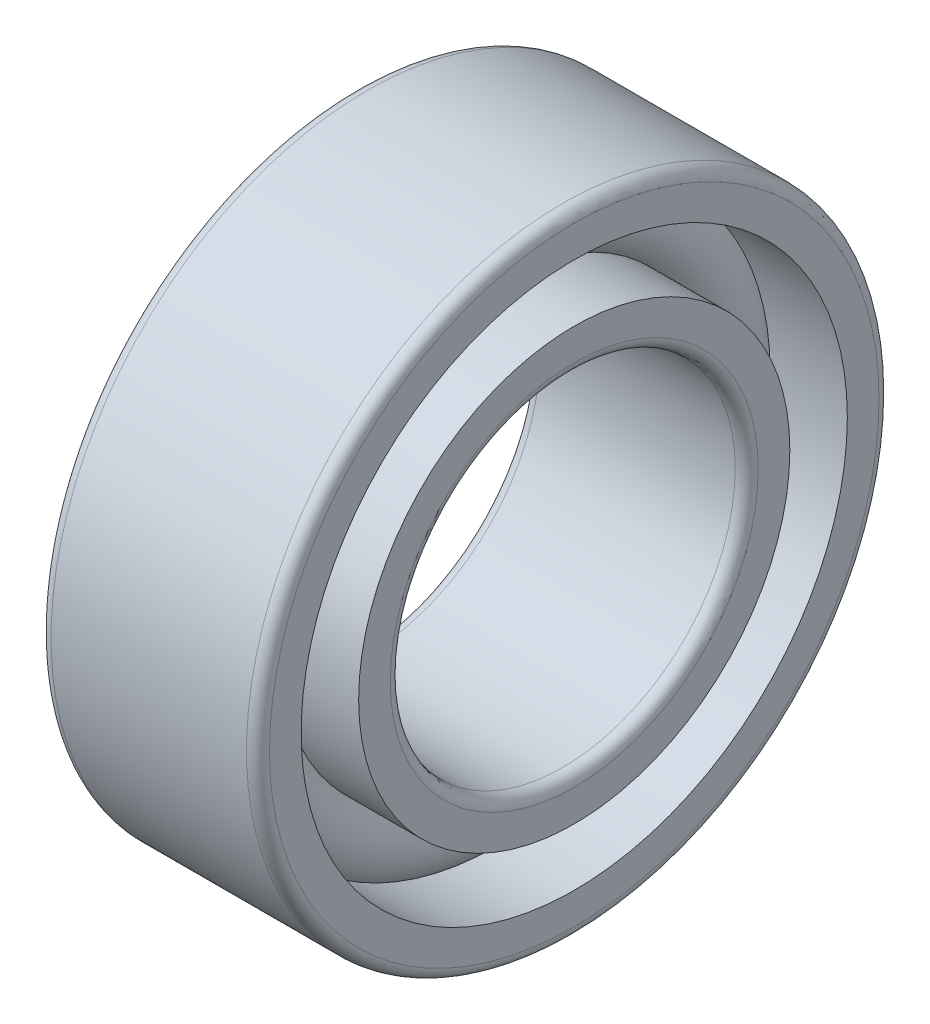
ISO-10303-21;
HEADER;
FILE_DESCRIPTION(('STEP AP214'),'2;1');
FILE_NAME('part.step','',(''),(''),'','','');
FILE_SCHEMA(('AUTOMOTIVE_DESIGN { 1 0 10303 214 1 1 1 1 }'));
ENDSEC;
DATA;
#1=APPLICATION_CONTEXT('core data for automotive mechanical design processes');
#2=APPLICATION_PROTOCOL_DEFINITION('international standard','automotive_design',2000,#1);
#3=PRODUCT_CONTEXT('',#1,'mechanical');
#4=PRODUCT('Part','Part','',(#3));
#5=PRODUCT_RELATED_PRODUCT_CATEGORY('part','',(#4));
#6=PRODUCT_DEFINITION_FORMATION('','',#4);
#7=PRODUCT_DEFINITION_CONTEXT('part definition',#1,'design');
#8=PRODUCT_DEFINITION('design','',#6,#7);
#9=PRODUCT_DEFINITION_SHAPE('','',#8);
#10=(LENGTH_UNIT() NAMED_UNIT(*) SI_UNIT(.MILLI.,.METRE.));
#11=(NAMED_UNIT(*) PLANE_ANGLE_UNIT() SI_UNIT($,.RADIAN.));
#12=(NAMED_UNIT(*) SI_UNIT($,.STERADIAN.) SOLID_ANGLE_UNIT());
#13=UNCERTAINTY_MEASURE_WITH_UNIT(LENGTH_MEASURE(1.E-05),#10,'distance_accuracy_value','');
#14=(GEOMETRIC_REPRESENTATION_CONTEXT(3) GLOBAL_UNCERTAINTY_ASSIGNED_CONTEXT((#13)) GLOBAL_UNIT_ASSIGNED_CONTEXT((#10,
#11,#12)) REPRESENTATION_CONTEXT('',''));
#15=CARTESIAN_POINT('',(0.,0.,0.));
#16=DIRECTION('',(0.,0.,1.));
#17=DIRECTION('',(1.,0.,0.));
#18=AXIS2_PLACEMENT_3D('',#15,#16,#17);
#19=CARTESIAN_POINT('',(0.,0.,0.));
#20=DIRECTION('',(-1.,0.,0.));
#21=DIRECTION('',(0.,0.,1.));
#22=AXIS2_PLACEMENT_3D('',#19,#20,#21);
#23=TOROIDAL_SURFACE('',#22,21.25,3.75);
#24=CARTESIAN_POINT('',(2.79508497187473,0.,0.));
#25=DIRECTION('',(-1.,0.,0.));
#26=DIRECTION('',(0.,0.,1.));
#27=AXIS2_PLACEMENT_3D('',#24,#25,#26);
#28=CIRCLE('',#27,23.75);
#29=CARTESIAN_POINT('',(2.79508497187473,0.,23.75));
#30=VERTEX_POINT('',#29);
#31=EDGE_CURVE('E39',#30,#30,#28,.F.);
#32=ORIENTED_EDGE('',*,*,#31,.T.);
#33=EDGE_LOOP('',(#32));
#34=FACE_BOUND('',#33,.T.);
#35=CARTESIAN_POINT('',(2.79508497187474,0.,0.));
#36=DIRECTION('',(-1.,0.,0.));
#37=DIRECTION('',(0.,0.,1.));
#38=AXIS2_PLACEMENT_3D('',#35,#36,#37);
#39=CIRCLE('',#38,18.75);
#40=CARTESIAN_POINT('',(2.79508497187474,0.,18.75));
#41=VERTEX_POINT('',#40);
#42=EDGE_CURVE('E10',#41,#41,#39,.T.);
#43=ORIENTED_EDGE('',*,*,#42,.T.);
#44=EDGE_LOOP('',(#43));
#45=FACE_BOUND('',#44,.T.);
#46=ADVANCED_FACE('F35',(#34,#45),#23,.T.);
#47=CARTESIAN_POINT('',(-20.6375,0.,0.));
#48=DIRECTION('',(1.,0.,0.));
#49=DIRECTION('',(0.,0.,-1.));
#50=AXIS2_PLACEMENT_3D('',#47,#48,#49);
#51=CYLINDRICAL_SURFACE('',#50,18.75);
#52=CARTESIAN_POINT('',(9.5,0.,0.));
#53=DIRECTION('',(1.,0.,0.));
#54=DIRECTION('',(0.,0.,-1.));
#55=AXIS2_PLACEMENT_3D('',#52,#53,#54);
#56=CIRCLE('',#55,18.75);
#57=CARTESIAN_POINT('',(9.5,0.,-18.75));
#58=VERTEX_POINT('',#57);
#59=EDGE_CURVE('E48',#58,#58,#56,.T.);
#60=ORIENTED_EDGE('',*,*,#59,.F.);
#61=EDGE_LOOP('',(#60));
#62=FACE_BOUND('',#61,.T.);
#63=ORIENTED_EDGE('',*,*,#42,.F.);
#64=EDGE_LOOP('',(#63));
#65=FACE_BOUND('',#64,.T.);
#66=ADVANCED_FACE('F87',(#62,#65),#51,.T.);
#67=CARTESIAN_POINT('',(-20.6375,0.,0.));
#68=DIRECTION('',(1.,0.,0.));
#69=DIRECTION('',(0.,0.,-1.));
#70=AXIS2_PLACEMENT_3D('',#67,#68,#69);
#71=CYLINDRICAL_SURFACE('',#70,18.75);
#72=CARTESIAN_POINT('',(-9.5,0.,0.));
#73=DIRECTION('',(1.,0.,0.));
#74=DIRECTION('',(0.,0.,-1.));
#75=AXIS2_PLACEMENT_3D('',#72,#73,#74);
#76=CIRCLE('',#75,18.75);
#77=CARTESIAN_POINT('',(-9.5,0.,-18.75));
#78=VERTEX_POINT('',#77);
#79=EDGE_CURVE('E57',#78,#78,#76,.T.);
#80=ORIENTED_EDGE('',*,*,#79,.T.);
#81=EDGE_LOOP('',(#80));
#82=FACE_BOUND('',#81,.T.);
#83=CARTESIAN_POINT('',(-2.79508497187474,0.,0.));
#84=DIRECTION('',(1.,0.,0.));
#85=DIRECTION('',(0.,0.,-1.));
#86=AXIS2_PLACEMENT_3D('',#83,#84,#85);
#87=CIRCLE('',#86,18.75);
#88=CARTESIAN_POINT('',(-2.79508497187474,0.,-18.75));
#89=VERTEX_POINT('',#88);
#90=EDGE_CURVE('E43',#89,#89,#87,.T.);
#91=ORIENTED_EDGE('',*,*,#90,.F.);
#92=EDGE_LOOP('',(#91));
#93=FACE_BOUND('',#92,.T.);
#94=ADVANCED_FACE('F90',(#82,#93),#71,.T.);
#95=CARTESIAN_POINT('',(9.5,16.,0.));
#96=DIRECTION('',(1.,0.,0.));
#97=DIRECTION('',(0.,0.,-1.));
#98=AXIS2_PLACEMENT_3D('',#95,#96,#97);
#99=PLANE('',#98);
#100=ORIENTED_EDGE('',*,*,#59,.T.);
#101=EDGE_LOOP('',(#100));
#102=FACE_BOUND('',#101,.T.);
#103=CARTESIAN_POINT('',(9.5,0.,0.));
#104=DIRECTION('',(1.,0.,0.));
#105=DIRECTION('',(0.,0.,-1.));
#106=AXIS2_PLACEMENT_3D('',#103,#104,#105);
#107=CIRCLE('',#106,16.);
#108=CARTESIAN_POINT('',(9.5,0.,-16.));
#109=VERTEX_POINT('',#108);
#110=EDGE_CURVE('E79',#109,#109,#107,.T.);
#111=ORIENTED_EDGE('',*,*,#110,.F.);
#112=EDGE_LOOP('',(#111));
#113=FACE_BOUND('',#112,.T.);
#114=ADVANCED_FACE('F84',(#102,#113),#99,.T.);
#115=CARTESIAN_POINT('',(8.5,0.,0.));
#116=DIRECTION('',(1.,0.,0.));
#117=DIRECTION('',(0.,0.,-1.));
#118=AXIS2_PLACEMENT_3D('',#115,#116,#117);
#119=TOROIDAL_SURFACE('',#118,16.,0.999999999999999);
#120=ORIENTED_EDGE('',*,*,#110,.T.);
#121=EDGE_LOOP('',(#120));
#122=FACE_BOUND('',#121,.T.);
#123=CARTESIAN_POINT('',(8.5,0.,0.));
#124=DIRECTION('',(1.,0.,0.));
#125=DIRECTION('',(0.,0.,-1.));
#126=AXIS2_PLACEMENT_3D('',#123,#124,#125);
#127=CIRCLE('',#126,15.);
#128=CARTESIAN_POINT('',(8.5,0.,-15.));
#129=VERTEX_POINT('',#128);
#130=EDGE_CURVE('E76',#129,#129,#127,.T.);
#131=ORIENTED_EDGE('',*,*,#130,.F.);
#132=EDGE_LOOP('',(#131));
#133=FACE_BOUND('',#132,.T.);
#134=ADVANCED_FACE('F101',(#122,#133),#119,.T.);
#135=CARTESIAN_POINT('',(-20.6375,0.,0.));
#136=DIRECTION('',(1.,0.,0.));
#137=DIRECTION('',(0.,0.,-1.));
#138=AXIS2_PLACEMENT_3D('',#135,#136,#137);
#139=CYLINDRICAL_SURFACE('',#138,15.);
#140=ORIENTED_EDGE('',*,*,#130,.T.);
#141=EDGE_LOOP('',(#140));
#142=FACE_BOUND('',#141,.T.);
#143=CARTESIAN_POINT('',(-8.5,0.,0.));
#144=DIRECTION('',(1.,0.,0.));
#145=DIRECTION('',(0.,0.,-1.));
#146=AXIS2_PLACEMENT_3D('',#143,#144,#145);
#147=CIRCLE('',#146,15.);
#148=CARTESIAN_POINT('',(-8.5,0.,-15.));
#149=VERTEX_POINT('',#148);
#150=EDGE_CURVE('E73',#149,#149,#147,.T.);
#151=ORIENTED_EDGE('',*,*,#150,.F.);
#152=EDGE_LOOP('',(#151));
#153=FACE_BOUND('',#152,.T.);
#154=ADVANCED_FACE('F104',(#142,#153),#139,.F.);
#155=CARTESIAN_POINT('',(-8.5,0.,0.));
#156=DIRECTION('',(1.,0.,0.));
#157=DIRECTION('',(0.,0.,-1.));
#158=AXIS2_PLACEMENT_3D('',#155,#156,#157);
#159=TOROIDAL_SURFACE('',#158,16.,0.999999999999999);
#160=ORIENTED_EDGE('',*,*,#150,.T.);
#161=EDGE_LOOP('',(#160));
#162=FACE_BOUND('',#161,.T.);
#163=CARTESIAN_POINT('',(-9.5,0.,0.));
#164=DIRECTION('',(1.,0.,0.));
#165=DIRECTION('',(0.,0.,-1.));
#166=AXIS2_PLACEMENT_3D('',#163,#164,#165);
#167=CIRCLE('',#166,16.);
#168=CARTESIAN_POINT('',(-9.5,0.,-16.));
#169=VERTEX_POINT('',#168);
#170=EDGE_CURVE('E70',#169,#169,#167,.T.);
#171=ORIENTED_EDGE('',*,*,#170,.F.);
#172=EDGE_LOOP('',(#171));
#173=FACE_BOUND('',#172,.T.);
#174=ADVANCED_FACE('F108',(#162,#173),#159,.T.);
#175=CARTESIAN_POINT('',(-9.5,18.75,0.));
#176=DIRECTION('',(-1.,0.,0.));
#177=DIRECTION('',(0.,0.,1.));
#178=AXIS2_PLACEMENT_3D('',#175,#176,#177);
#179=PLANE('',#178);
#180=ORIENTED_EDGE('',*,*,#170,.T.);
#181=EDGE_LOOP('',(#180));
#182=FACE_BOUND('',#181,.T.);
#183=ORIENTED_EDGE('',*,*,#79,.F.);
#184=EDGE_LOOP('',(#183));
#185=FACE_BOUND('',#184,.T.);
#186=ADVANCED_FACE('F112',(#182,#185),#179,.T.);
#187=CARTESIAN_POINT('',(-2.79508497187473,0.,0.));
#188=DIRECTION('',(1.,0.,0.));
#189=DIRECTION('',(0.,0.,-1.));
#190=AXIS2_PLACEMENT_3D('',#187,#188,#189);
#191=CIRCLE('',#190,23.75);
#192=CARTESIAN_POINT('',(-2.79508497187473,0.,-23.75));
#193=VERTEX_POINT('',#192);
#194=EDGE_CURVE('E51',#193,#193,#191,.F.);
#195=ORIENTED_EDGE('',*,*,#194,.T.);
#196=EDGE_LOOP('',(#195));
#197=FACE_BOUND('',#196,.T.);
#198=ORIENTED_EDGE('',*,*,#90,.T.);
#199=EDGE_LOOP('',(#198));
#200=FACE_BOUND('',#199,.T.);
#201=ADVANCED_FACE('F37',(#197,#200),#23,.T.);
#202=CARTESIAN_POINT('',(-20.6375,0.,0.));
#203=DIRECTION('',(1.,0.,0.));
#204=DIRECTION('',(0.,0.,-1.));
#205=AXIS2_PLACEMENT_3D('',#202,#203,#204);
#206=CYLINDRICAL_SURFACE('',#205,23.75);
#207=CARTESIAN_POINT('',(9.5,0.,0.));
#208=DIRECTION('',(1.,0.,0.));
#209=DIRECTION('',(0.,0.,-1.));
#210=AXIS2_PLACEMENT_3D('',#207,#208,#209);
#211=CIRCLE('',#210,23.75);
#212=CARTESIAN_POINT('',(9.5,0.,-23.75));
#213=VERTEX_POINT('',#212);
#214=EDGE_CURVE('E53',#213,#213,#211,.T.);
#215=ORIENTED_EDGE('',*,*,#214,.T.);
#216=EDGE_LOOP('',(#215));
#217=FACE_BOUND('',#216,.T.);
#218=ORIENTED_EDGE('',*,*,#31,.F.);
#219=EDGE_LOOP('',(#218));
#220=FACE_BOUND('',#219,.T.);
#221=ADVANCED_FACE('F117',(#217,#220),#206,.F.);
#222=CARTESIAN_POINT('',(-20.6375,0.,0.));
#223=DIRECTION('',(1.,0.,0.));
#224=DIRECTION('',(0.,0.,-1.));
#225=AXIS2_PLACEMENT_3D('',#222,#223,#224);
#226=CYLINDRICAL_SURFACE('',#225,23.75);
#227=CARTESIAN_POINT('',(-9.5,0.,0.));
#228=DIRECTION('',(1.,0.,0.));
#229=DIRECTION('',(0.,0.,-1.));
#230=AXIS2_PLACEMENT_3D('',#227,#228,#229);
#231=CIRCLE('',#230,23.75);
#232=CARTESIAN_POINT('',(-9.5,0.,-23.75));
#233=VERTEX_POINT('',#232);
#234=EDGE_CURVE('E148',#233,#233,#231,.T.);
#235=ORIENTED_EDGE('',*,*,#234,.F.);
#236=EDGE_LOOP('',(#235));
#237=FACE_BOUND('',#236,.T.);
#238=ORIENTED_EDGE('',*,*,#194,.F.);
#239=EDGE_LOOP('',(#238));
#240=FACE_BOUND('',#239,.T.);
#241=ADVANCED_FACE('F120',(#237,#240),#226,.F.);
#242=CARTESIAN_POINT('',(9.5,26.5,0.));
#243=DIRECTION('',(1.,0.,0.));
#244=DIRECTION('',(0.,0.,-1.));
#245=AXIS2_PLACEMENT_3D('',#242,#243,#244);
#246=PLANE('',#245);
#247=CARTESIAN_POINT('',(9.5,0.,0.));
#248=DIRECTION('',(1.,0.,0.));
#249=DIRECTION('',(0.,0.,-1.));
#250=AXIS2_PLACEMENT_3D('',#247,#248,#249);
#251=CIRCLE('',#250,26.5);
#252=CARTESIAN_POINT('',(9.5,0.,-26.5));
#253=VERTEX_POINT('',#252);
#254=EDGE_CURVE('E59',#253,#253,#251,.T.);
#255=ORIENTED_EDGE('',*,*,#254,.T.);
#256=EDGE_LOOP('',(#255));
#257=FACE_BOUND('',#256,.T.);
#258=ORIENTED_EDGE('',*,*,#214,.F.);
#259=EDGE_LOOP('',(#258));
#260=FACE_BOUND('',#259,.T.);
#261=ADVANCED_FACE('F121',(#257,#260),#246,.T.);
#262=CARTESIAN_POINT('',(8.5,0.,0.));
#263=DIRECTION('',(1.,0.,0.));
#264=DIRECTION('',(0.,0.,-1.));
#265=AXIS2_PLACEMENT_3D('',#262,#263,#264);
#266=TOROIDAL_SURFACE('',#265,26.5,1.);
#267=CARTESIAN_POINT('',(8.5,0.,0.));
#268=DIRECTION('',(1.,0.,0.));
#269=DIRECTION('',(0.,0.,-1.));
#270=AXIS2_PLACEMENT_3D('',#267,#268,#269);
#271=CIRCLE('',#270,27.5);
#272=CARTESIAN_POINT('',(8.5,0.,-27.5));
#273=VERTEX_POINT('',#272);
#274=EDGE_CURVE('E64',#273,#273,#271,.T.);
#275=ORIENTED_EDGE('',*,*,#274,.T.);
#276=EDGE_LOOP('',(#275));
#277=FACE_BOUND('',#276,.T.);
#278=ORIENTED_EDGE('',*,*,#254,.F.);
#279=EDGE_LOOP('',(#278));
#280=FACE_BOUND('',#279,.T.);
#281=ADVANCED_FACE('F124',(#277,#280),#266,.T.);
#282=CARTESIAN_POINT('',(-20.6375,0.,0.));
#283=DIRECTION('',(1.,0.,0.));
#284=DIRECTION('',(0.,0.,-1.));
#285=AXIS2_PLACEMENT_3D('',#282,#283,#284);
#286=CYLINDRICAL_SURFACE('',#285,27.5);
#287=CARTESIAN_POINT('',(-8.5,0.,0.));
#288=DIRECTION('',(1.,0.,0.));
#289=DIRECTION('',(0.,0.,-1.));
#290=AXIS2_PLACEMENT_3D('',#287,#288,#289);
#291=CIRCLE('',#290,27.5);
#292=CARTESIAN_POINT('',(-8.5,0.,-27.5));
#293=VERTEX_POINT('',#292);
#294=EDGE_CURVE('E152',#293,#293,#291,.T.);
#295=ORIENTED_EDGE('',*,*,#294,.T.);
#296=EDGE_LOOP('',(#295));
#297=FACE_BOUND('',#296,.T.);
#298=ORIENTED_EDGE('',*,*,#274,.F.);
#299=EDGE_LOOP('',(#298));
#300=FACE_BOUND('',#299,.T.);
#301=ADVANCED_FACE('F128',(#297,#300),#286,.T.);
#302=CARTESIAN_POINT('',(-8.5,0.,0.));
#303=DIRECTION('',(1.,0.,0.));
#304=DIRECTION('',(0.,0.,-1.));
#305=AXIS2_PLACEMENT_3D('',#302,#303,#304);
#306=TOROIDAL_SURFACE('',#305,26.5,1.);
#307=CARTESIAN_POINT('',(-9.50000000000001,0.,0.));
#308=DIRECTION('',(1.,0.,0.));
#309=DIRECTION('',(0.,0.,-1.));
#310=AXIS2_PLACEMENT_3D('',#307,#308,#309);
#311=CIRCLE('',#310,26.5);
#312=CARTESIAN_POINT('',(-9.50000000000001,0.,-26.5));
#313=VERTEX_POINT('',#312);
#314=EDGE_CURVE('E149',#313,#313,#311,.T.);
#315=ORIENTED_EDGE('',*,*,#314,.T.);
#316=EDGE_LOOP('',(#315));
#317=FACE_BOUND('',#316,.T.);
#318=ORIENTED_EDGE('',*,*,#294,.F.);
#319=EDGE_LOOP('',(#318));
#320=FACE_BOUND('',#319,.T.);
#321=ADVANCED_FACE('F132',(#317,#320),#306,.T.);
#322=CARTESIAN_POINT('',(-9.5,23.75,0.));
#323=DIRECTION('',(-1.,0.,0.));
#324=DIRECTION('',(0.,0.,1.));
#325=AXIS2_PLACEMENT_3D('',#322,#323,#324);
#326=PLANE('',#325);
#327=ORIENTED_EDGE('',*,*,#234,.T.);
#328=EDGE_LOOP('',(#327));
#329=FACE_BOUND('',#328,.T.);
#330=ORIENTED_EDGE('',*,*,#314,.F.);
#331=EDGE_LOOP('',(#330));
#332=FACE_BOUND('',#331,.T.);
#333=ADVANCED_FACE('F136',(#329,#332),#326,.T.);
#334=CLOSED_SHELL('',(#46,#66,#94,#114,#134,#154,#174,#186,#201,#221,#241,#261,#281,#301,#321,#333));
#335=MANIFOLD_SOLID_BREP('B2',#334);
#336=ADVANCED_BREP_SHAPE_REPRESENTATION('',(#18,#335),#14);
#337=SHAPE_DEFINITION_REPRESENTATION(#9,#336);
ENDSEC;
END-ISO-10303-21;
